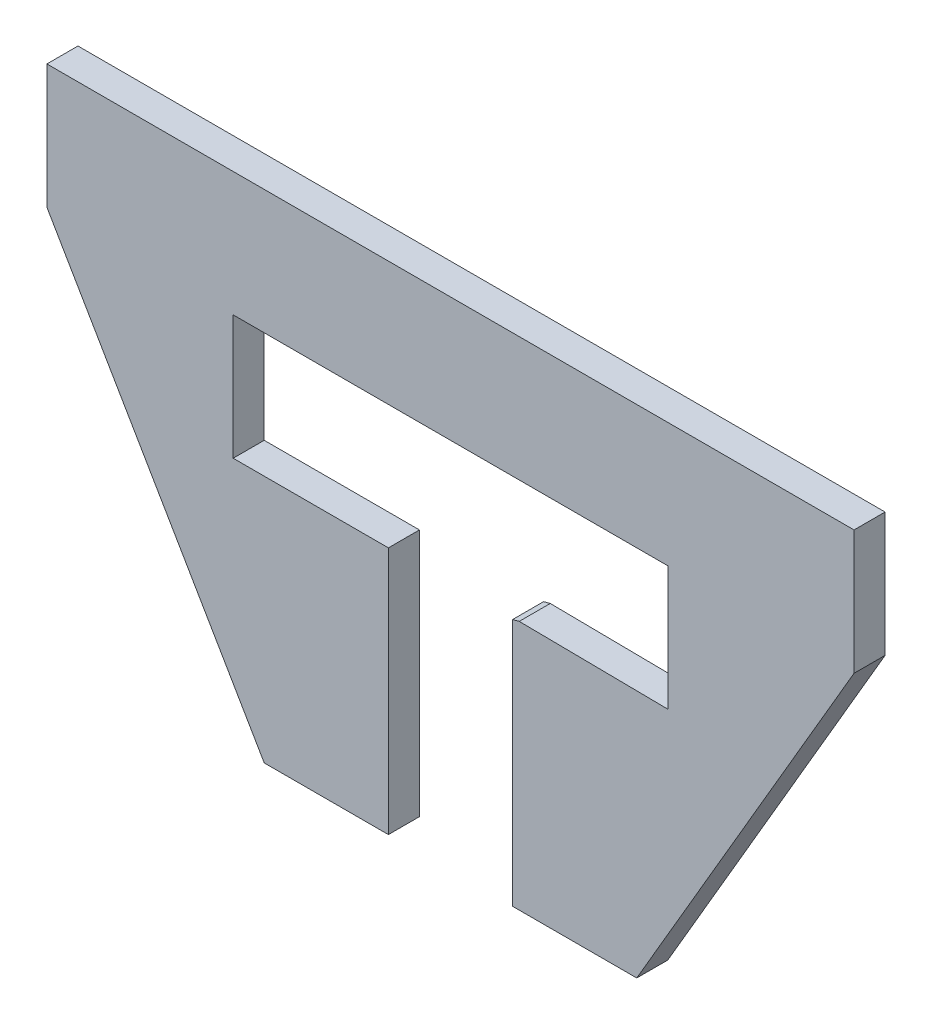
ISO-10303-21;
HEADER;
FILE_DESCRIPTION(('STEP AP214'),'2;1');
FILE_NAME('part.step','',(''),(''),'','','');
FILE_SCHEMA(('AUTOMOTIVE_DESIGN { 1 0 10303 214 1 1 1 1 }'));
ENDSEC;
DATA;
#1=APPLICATION_CONTEXT('core data for automotive mechanical design processes');
#2=APPLICATION_PROTOCOL_DEFINITION('international standard','automotive_design',2000,#1);
#3=PRODUCT_CONTEXT('',#1,'mechanical');
#4=PRODUCT('Part','Part','',(#3));
#5=PRODUCT_RELATED_PRODUCT_CATEGORY('part','',(#4));
#6=PRODUCT_DEFINITION_FORMATION('','',#4);
#7=PRODUCT_DEFINITION_CONTEXT('part definition',#1,'design');
#8=PRODUCT_DEFINITION('design','',#6,#7);
#9=PRODUCT_DEFINITION_SHAPE('','',#8);
#10=(LENGTH_UNIT() NAMED_UNIT(*) SI_UNIT(.MILLI.,.METRE.));
#11=(NAMED_UNIT(*) PLANE_ANGLE_UNIT() SI_UNIT($,.RADIAN.));
#12=(NAMED_UNIT(*) SI_UNIT($,.STERADIAN.) SOLID_ANGLE_UNIT());
#13=UNCERTAINTY_MEASURE_WITH_UNIT(LENGTH_MEASURE(1.E-05),#10,'distance_accuracy_value','');
#14=(GEOMETRIC_REPRESENTATION_CONTEXT(3) GLOBAL_UNCERTAINTY_ASSIGNED_CONTEXT((#13)) GLOBAL_UNIT_ASSIGNED_CONTEXT((#10,
#11,#12)) REPRESENTATION_CONTEXT('',''));
#15=CARTESIAN_POINT('',(0.,0.,0.));
#16=DIRECTION('',(0.,0.,1.));
#17=DIRECTION('',(1.,0.,0.));
#18=AXIS2_PLACEMENT_3D('',#15,#16,#17);
#19=CARTESIAN_POINT('',(0.,0.,6.35));
#20=DIRECTION('',(0.,1.,0.));
#21=DIRECTION('',(0.,0.,1.));
#22=AXIS2_PLACEMENT_3D('',#19,#20,#21);
#23=PLANE('',#22);
#24=DIRECTION('',(1.,0.,0.));
#25=VECTOR('',#24,1.);
#26=CARTESIAN_POINT('',(0.,0.,0.));
#27=LINE('',#26,#25);
#28=CARTESIAN_POINT('',(44.45,0.,0.));
#29=VERTEX_POINT('',#28);
#30=CARTESIAN_POINT('',(69.85,0.,0.));
#31=VERTEX_POINT('',#30);
#32=EDGE_CURVE('E131',#29,#31,#27,.T.);
#33=ORIENTED_EDGE('',*,*,#32,.T.);
#34=DIRECTION('',(0.,0.,1.));
#35=VECTOR('',#34,1.);
#36=CARTESIAN_POINT('',(69.85,0.,0.));
#37=LINE('',#36,#35);
#38=CARTESIAN_POINT('',(69.85,0.,6.35));
#39=VERTEX_POINT('',#38);
#40=EDGE_CURVE('E167',#31,#39,#37,.T.);
#41=ORIENTED_EDGE('',*,*,#40,.T.);
#42=DIRECTION('',(1.,0.,0.));
#43=VECTOR('',#42,1.);
#44=CARTESIAN_POINT('',(0.,0.,6.35));
#45=LINE('',#44,#43);
#46=CARTESIAN_POINT('',(44.45,0.,6.35));
#47=VERTEX_POINT('',#46);
#48=EDGE_CURVE('E252',#47,#39,#45,.T.);
#49=ORIENTED_EDGE('',*,*,#48,.F.);
#50=DIRECTION('',(0.,0.,-1.));
#51=VECTOR('',#50,1.);
#52=CARTESIAN_POINT('',(44.45,0.,6.35));
#53=LINE('',#52,#51);
#54=EDGE_CURVE('E127',#47,#29,#53,.T.);
#55=ORIENTED_EDGE('',*,*,#54,.T.);
#56=EDGE_LOOP('',(#33,#41,#49,#55));
#57=FACE_BOUND('',#56,.T.);
#58=ADVANCED_FACE('F33',(#57),#23,.F.);
#59=CARTESIAN_POINT('',(95.25,0.,6.35));
#60=VERTEX_POINT('',#59);
#61=CARTESIAN_POINT('',(120.65,0.,6.35));
#62=VERTEX_POINT('',#61);
#63=EDGE_CURVE('E92',#60,#62,#45,.T.);
#64=ORIENTED_EDGE('',*,*,#63,.F.);
#65=DIRECTION('',(0.,0.,1.));
#66=VECTOR('',#65,1.);
#67=CARTESIAN_POINT('',(95.25,0.,0.));
#68=LINE('',#67,#66);
#69=CARTESIAN_POINT('',(95.25,0.,0.));
#70=VERTEX_POINT('',#69);
#71=EDGE_CURVE('E249',#70,#60,#68,.T.);
#72=ORIENTED_EDGE('',*,*,#71,.F.);
#73=CARTESIAN_POINT('',(120.65,0.,0.));
#74=VERTEX_POINT('',#73);
#75=EDGE_CURVE('E135',#70,#74,#27,.T.);
#76=ORIENTED_EDGE('',*,*,#75,.T.);
#77=DIRECTION('',(0.,0.,-1.));
#78=VECTOR('',#77,1.);
#79=CARTESIAN_POINT('',(120.65,0.,6.35));
#80=LINE('',#79,#78);
#81=EDGE_CURVE('E11',#62,#74,#80,.T.);
#82=ORIENTED_EDGE('',*,*,#81,.F.);
#83=EDGE_LOOP('',(#64,#72,#76,#82));
#84=FACE_BOUND('',#83,.T.);
#85=ADVANCED_FACE('F35',(#84),#23,.F.);
#86=CARTESIAN_POINT('',(90.0186528497409,-52.5108808290155,6.35));
#87=DIRECTION('',(-0.863778900898433,0.503871025524086,0.));
#88=DIRECTION('',(-0.503871025524086,-0.863778900898434,0.));
#89=AXIS2_PLACEMENT_3D('',#86,#87,#88);
#90=PLANE('',#89);
#91=DIRECTION('',(0.503871025524086,0.863778900898434,0.));
#92=VECTOR('',#91,1.);
#93=CARTESIAN_POINT('',(90.0186528497409,-52.5108808290155,0.));
#94=LINE('',#93,#92);
#95=CARTESIAN_POINT('',(165.1,76.2000000000001,0.));
#96=VERTEX_POINT('',#95);
#97=EDGE_CURVE('E134',#74,#96,#94,.T.);
#98=ORIENTED_EDGE('',*,*,#97,.T.);
#99=DIRECTION('',(0.,0.,-1.));
#100=VECTOR('',#99,1.);
#101=CARTESIAN_POINT('',(165.1,76.2000000000001,6.35));
#102=LINE('',#101,#100);
#103=CARTESIAN_POINT('',(165.1,76.2000000000001,6.35));
#104=VERTEX_POINT('',#103);
#105=EDGE_CURVE('E41',#104,#96,#102,.T.);
#106=ORIENTED_EDGE('',*,*,#105,.F.);
#107=DIRECTION('',(0.503871025524086,0.863778900898434,0.));
#108=VECTOR('',#107,1.);
#109=CARTESIAN_POINT('',(90.0186528497409,-52.5108808290155,6.35));
#110=LINE('',#109,#108);
#111=EDGE_CURVE('E254',#62,#104,#110,.T.);
#112=ORIENTED_EDGE('',*,*,#111,.F.);
#113=ORIENTED_EDGE('',*,*,#81,.T.);
#114=EDGE_LOOP('',(#98,#106,#112,#113));
#115=FACE_BOUND('',#114,.T.);
#116=ADVANCED_FACE('F256',(#115),#90,.F.);
#117=CARTESIAN_POINT('',(165.1,0.,6.35));
#118=DIRECTION('',(-1.,0.,0.));
#119=DIRECTION('',(0.,0.,1.));
#120=AXIS2_PLACEMENT_3D('',#117,#118,#119);
#121=PLANE('',#120);
#122=DIRECTION('',(0.,1.,0.));
#123=VECTOR('',#122,1.);
#124=CARTESIAN_POINT('',(165.1,0.,0.));
#125=LINE('',#124,#123);
#126=CARTESIAN_POINT('',(165.1,101.6,0.));
#127=VERTEX_POINT('',#126);
#128=EDGE_CURVE('E137',#96,#127,#125,.T.);
#129=ORIENTED_EDGE('',*,*,#128,.T.);
#130=DIRECTION('',(0.,0.,-1.));
#131=VECTOR('',#130,1.);
#132=CARTESIAN_POINT('',(165.1,101.6,6.35));
#133=LINE('',#132,#131);
#134=CARTESIAN_POINT('',(165.1,101.6,6.35));
#135=VERTEX_POINT('',#134);
#136=EDGE_CURVE('E115',#135,#127,#133,.T.);
#137=ORIENTED_EDGE('',*,*,#136,.F.);
#138=DIRECTION('',(0.,1.,0.));
#139=VECTOR('',#138,1.);
#140=CARTESIAN_POINT('',(165.1,0.,6.35));
#141=LINE('',#140,#139);
#142=EDGE_CURVE('E122',#104,#135,#141,.T.);
#143=ORIENTED_EDGE('',*,*,#142,.F.);
#144=ORIENTED_EDGE('',*,*,#105,.T.);
#145=EDGE_LOOP('',(#129,#137,#143,#144));
#146=FACE_BOUND('',#145,.T.);
#147=ADVANCED_FACE('F150',(#146),#121,.F.);
#148=CARTESIAN_POINT('',(0.,101.6,6.35));
#149=DIRECTION('',(0.,1.,0.));
#150=DIRECTION('',(0.,0.,1.));
#151=AXIS2_PLACEMENT_3D('',#148,#149,#150);
#152=PLANE('',#151);
#153=DIRECTION('',(1.,0.,0.));
#154=VECTOR('',#153,1.);
#155=CARTESIAN_POINT('',(0.,101.6,0.));
#156=LINE('',#155,#154);
#157=CARTESIAN_POINT('',(0.,101.6,0.));
#158=VERTEX_POINT('',#157);
#159=EDGE_CURVE('E110',#158,#127,#156,.T.);
#160=ORIENTED_EDGE('',*,*,#159,.F.);
#161=DIRECTION('',(0.,0.,-1.));
#162=VECTOR('',#161,1.);
#163=CARTESIAN_POINT('',(0.,101.6,6.35));
#164=LINE('',#163,#162);
#165=CARTESIAN_POINT('',(0.,101.6,6.35));
#166=VERTEX_POINT('',#165);
#167=EDGE_CURVE('E105',#166,#158,#164,.T.);
#168=ORIENTED_EDGE('',*,*,#167,.F.);
#169=DIRECTION('',(1.,0.,0.));
#170=VECTOR('',#169,1.);
#171=CARTESIAN_POINT('',(0.,101.6,6.35));
#172=LINE('',#171,#170);
#173=EDGE_CURVE('E108',#166,#135,#172,.T.);
#174=ORIENTED_EDGE('',*,*,#173,.T.);
#175=ORIENTED_EDGE('',*,*,#136,.T.);
#176=EDGE_LOOP('',(#160,#168,#174,#175));
#177=FACE_BOUND('',#176,.T.);
#178=ADVANCED_FACE('F107',(#177),#152,.T.);
#179=CARTESIAN_POINT('',(0.,0.,6.35));
#180=DIRECTION('',(-1.,0.,0.));
#181=DIRECTION('',(0.,0.,1.));
#182=AXIS2_PLACEMENT_3D('',#179,#180,#181);
#183=PLANE('',#182);
#184=DIRECTION('',(0.,1.,0.));
#185=VECTOR('',#184,1.);
#186=CARTESIAN_POINT('',(0.,0.,0.));
#187=LINE('',#186,#185);
#188=CARTESIAN_POINT('',(0.,76.2,0.));
#189=VERTEX_POINT('',#188);
#190=EDGE_CURVE('E141',#189,#158,#187,.T.);
#191=ORIENTED_EDGE('',*,*,#190,.F.);
#192=DIRECTION('',(0.,0.,-1.));
#193=VECTOR('',#192,1.);
#194=CARTESIAN_POINT('',(0.,76.2,6.35));
#195=LINE('',#194,#193);
#196=CARTESIAN_POINT('',(0.,76.2,6.35));
#197=VERTEX_POINT('',#196);
#198=EDGE_CURVE('E116',#197,#189,#195,.T.);
#199=ORIENTED_EDGE('',*,*,#198,.F.);
#200=DIRECTION('',(0.,1.,0.));
#201=VECTOR('',#200,1.);
#202=CARTESIAN_POINT('',(0.,0.,6.35));
#203=LINE('',#202,#201);
#204=EDGE_CURVE('E120',#197,#166,#203,.T.);
#205=ORIENTED_EDGE('',*,*,#204,.T.);
#206=ORIENTED_EDGE('',*,*,#167,.T.);
#207=EDGE_LOOP('',(#191,#199,#205,#206));
#208=FACE_BOUND('',#207,.T.);
#209=ADVANCED_FACE('F125',(#208),#183,.T.);
#210=CARTESIAN_POINT('',(33.1647668393782,19.3461139896373,6.35));
#211=DIRECTION('',(0.863778900898433,0.503871025524086,0.));
#212=DIRECTION('',(-0.503871025524086,0.863778900898433,0.));
#213=AXIS2_PLACEMENT_3D('',#210,#211,#212);
#214=PLANE('',#213);
#215=DIRECTION('',(0.503871025524086,-0.863778900898433,0.));
#216=VECTOR('',#215,1.);
#217=CARTESIAN_POINT('',(33.1647668393782,19.3461139896373,0.));
#218=LINE('',#217,#216);
#219=EDGE_CURVE('E84',#189,#29,#218,.T.);
#220=ORIENTED_EDGE('',*,*,#219,.T.);
#221=ORIENTED_EDGE('',*,*,#54,.F.);
#222=DIRECTION('',(0.503871025524086,-0.863778900898433,0.));
#223=VECTOR('',#222,1.);
#224=CARTESIAN_POINT('',(33.1647668393782,19.3461139896373,6.35));
#225=LINE('',#224,#223);
#226=EDGE_CURVE('E57',#197,#47,#225,.T.);
#227=ORIENTED_EDGE('',*,*,#226,.F.);
#228=ORIENTED_EDGE('',*,*,#198,.T.);
#229=EDGE_LOOP('',(#220,#221,#227,#228));
#230=FACE_BOUND('',#229,.T.);
#231=ADVANCED_FACE('F325',(#230),#214,.F.);
#232=CARTESIAN_POINT('',(0.,0.,6.35));
#233=DIRECTION('',(0.,0.,1.));
#234=DIRECTION('',(1.,0.,0.));
#235=AXIS2_PLACEMENT_3D('',#232,#233,#234);
#236=PLANE('',#235);
#237=DIRECTION('',(0.,-1.,0.));
#238=VECTOR('',#237,1.);
#239=CARTESIAN_POINT('',(69.85,0.,6.35));
#240=LINE('',#239,#238);
#241=CARTESIAN_POINT('',(69.85,50.8,6.35));
#242=VERTEX_POINT('',#241);
#243=EDGE_CURVE('E233',#242,#39,#240,.T.);
#244=ORIENTED_EDGE('',*,*,#243,.F.);
#245=DIRECTION('',(1.,0.,0.));
#246=VECTOR('',#245,1.);
#247=CARTESIAN_POINT('',(38.1,50.8,6.35));
#248=LINE('',#247,#246);
#249=CARTESIAN_POINT('',(38.1,50.8,6.35));
#250=VERTEX_POINT('',#249);
#251=EDGE_CURVE('E218',#250,#242,#248,.T.);
#252=ORIENTED_EDGE('',*,*,#251,.F.);
#253=DIRECTION('',(0.,-1.,0.));
#254=VECTOR('',#253,1.);
#255=CARTESIAN_POINT('',(38.1,76.2,6.35));
#256=LINE('',#255,#254);
#257=CARTESIAN_POINT('',(38.1,76.2,6.35));
#258=VERTEX_POINT('',#257);
#259=EDGE_CURVE('E227',#258,#250,#256,.T.);
#260=ORIENTED_EDGE('',*,*,#259,.F.);
#261=DIRECTION('',(-1.,0.,0.));
#262=VECTOR('',#261,1.);
#263=CARTESIAN_POINT('',(38.1,76.2,6.35));
#264=LINE('',#263,#262);
#265=CARTESIAN_POINT('',(127.,76.2,6.35));
#266=VERTEX_POINT('',#265);
#267=EDGE_CURVE('E231',#266,#258,#264,.T.);
#268=ORIENTED_EDGE('',*,*,#267,.F.);
#269=DIRECTION('',(0.,1.,0.));
#270=VECTOR('',#269,1.);
#271=CARTESIAN_POINT('',(127.,76.2,6.35));
#272=LINE('',#271,#270);
#273=CARTESIAN_POINT('',(127.,50.8,6.35));
#274=VERTEX_POINT('',#273);
#275=EDGE_CURVE('E286',#274,#266,#272,.T.);
#276=ORIENTED_EDGE('',*,*,#275,.F.);
#277=DIRECTION('',(0.999931260893416,-0.0117249088739658,0.));
#278=VECTOR('',#277,1.);
#279=CARTESIAN_POINT('',(96.6132257549767,51.1563066511975,6.35));
#280=LINE('',#279,#278);
#281=CARTESIAN_POINT('',(96.6132257549767,51.1563066511975,6.35));
#282=VERTEX_POINT('',#281);
#283=EDGE_CURVE('E283',#282,#274,#280,.T.);
#284=ORIENTED_EDGE('',*,*,#283,.F.);
#285=DIRECTION('',(0.967498850455713,0.252875412736932,0.));
#286=VECTOR('',#285,1.);
#287=CARTESIAN_POINT('',(95.25,50.8,6.35));
#288=LINE('',#287,#286);
#289=CARTESIAN_POINT('',(95.25,50.8,6.35));
#290=VERTEX_POINT('',#289);
#291=EDGE_CURVE('E280',#290,#282,#288,.T.);
#292=ORIENTED_EDGE('',*,*,#291,.F.);
#293=DIRECTION('',(0.,1.,0.));
#294=VECTOR('',#293,1.);
#295=CARTESIAN_POINT('',(95.25,0.,6.35));
#296=LINE('',#295,#294);
#297=EDGE_CURVE('E277',#60,#290,#296,.T.);
#298=ORIENTED_EDGE('',*,*,#297,.F.);
#299=ORIENTED_EDGE('',*,*,#63,.T.);
#300=ORIENTED_EDGE('',*,*,#111,.T.);
#301=ORIENTED_EDGE('',*,*,#142,.T.);
#302=ORIENTED_EDGE('',*,*,#173,.F.);
#303=ORIENTED_EDGE('',*,*,#204,.F.);
#304=ORIENTED_EDGE('',*,*,#226,.T.);
#305=ORIENTED_EDGE('',*,*,#48,.T.);
#306=EDGE_LOOP('',(#244,#252,#260,#268,#276,#284,#292,#298,#299,#300,#301,#302,#303,#304,#305));
#307=FACE_BOUND('',#306,.T.);
#308=ADVANCED_FACE('F119',(#307),#236,.T.);
#309=CARTESIAN_POINT('',(0.,0.,0.));
#310=DIRECTION('',(0.,0.,1.));
#311=DIRECTION('',(1.,0.,0.));
#312=AXIS2_PLACEMENT_3D('',#309,#310,#311);
#313=PLANE('',#312);
#314=DIRECTION('',(1.,0.,0.));
#315=VECTOR('',#314,1.);
#316=CARTESIAN_POINT('',(38.1,50.8,0.));
#317=LINE('',#316,#315);
#318=CARTESIAN_POINT('',(38.1,50.8,0.));
#319=VERTEX_POINT('',#318);
#320=CARTESIAN_POINT('',(69.85,50.8,0.));
#321=VERTEX_POINT('',#320);
#322=EDGE_CURVE('E219',#319,#321,#317,.T.);
#323=ORIENTED_EDGE('',*,*,#322,.T.);
#324=DIRECTION('',(0.,-1.,0.));
#325=VECTOR('',#324,1.);
#326=CARTESIAN_POINT('',(69.85,0.,0.));
#327=LINE('',#326,#325);
#328=EDGE_CURVE('E161',#321,#31,#327,.T.);
#329=ORIENTED_EDGE('',*,*,#328,.T.);
#330=ORIENTED_EDGE('',*,*,#32,.F.);
#331=ORIENTED_EDGE('',*,*,#219,.F.);
#332=ORIENTED_EDGE('',*,*,#190,.T.);
#333=ORIENTED_EDGE('',*,*,#159,.T.);
#334=ORIENTED_EDGE('',*,*,#128,.F.);
#335=ORIENTED_EDGE('',*,*,#97,.F.);
#336=ORIENTED_EDGE('',*,*,#75,.F.);
#337=DIRECTION('',(0.,1.,0.));
#338=VECTOR('',#337,1.);
#339=CARTESIAN_POINT('',(95.25,0.,0.));
#340=LINE('',#339,#338);
#341=CARTESIAN_POINT('',(95.25,50.8,0.));
#342=VERTEX_POINT('',#341);
#343=EDGE_CURVE('E235',#70,#342,#340,.T.);
#344=ORIENTED_EDGE('',*,*,#343,.T.);
#345=DIRECTION('',(0.967498850455713,0.252875412736932,0.));
#346=VECTOR('',#345,1.);
#347=CARTESIAN_POINT('',(95.25,50.8,0.));
#348=LINE('',#347,#346);
#349=CARTESIAN_POINT('',(96.6132257549767,51.1563066511975,0.));
#350=VERTEX_POINT('',#349);
#351=EDGE_CURVE('E48',#342,#350,#348,.T.);
#352=ORIENTED_EDGE('',*,*,#351,.T.);
#353=DIRECTION('',(0.999931260893416,-0.0117249088739658,0.));
#354=VECTOR('',#353,1.);
#355=CARTESIAN_POINT('',(96.6132257549767,51.1563066511975,0.));
#356=LINE('',#355,#354);
#357=CARTESIAN_POINT('',(127.,50.8,0.));
#358=VERTEX_POINT('',#357);
#359=EDGE_CURVE('E263',#350,#358,#356,.T.);
#360=ORIENTED_EDGE('',*,*,#359,.T.);
#361=DIRECTION('',(0.,1.,0.));
#362=VECTOR('',#361,1.);
#363=CARTESIAN_POINT('',(127.,76.2,0.));
#364=LINE('',#363,#362);
#365=CARTESIAN_POINT('',(127.,76.2,0.));
#366=VERTEX_POINT('',#365);
#367=EDGE_CURVE('E267',#358,#366,#364,.T.);
#368=ORIENTED_EDGE('',*,*,#367,.T.);
#369=DIRECTION('',(-1.,0.,0.));
#370=VECTOR('',#369,1.);
#371=CARTESIAN_POINT('',(38.1,76.2,0.));
#372=LINE('',#371,#370);
#373=CARTESIAN_POINT('',(38.1,76.2,0.));
#374=VERTEX_POINT('',#373);
#375=EDGE_CURVE('E270',#366,#374,#372,.T.);
#376=ORIENTED_EDGE('',*,*,#375,.T.);
#377=DIRECTION('',(0.,-1.,0.));
#378=VECTOR('',#377,1.);
#379=CARTESIAN_POINT('',(38.1,76.2,0.));
#380=LINE('',#379,#378);
#381=EDGE_CURVE('E273',#374,#319,#380,.T.);
#382=ORIENTED_EDGE('',*,*,#381,.T.);
#383=EDGE_LOOP('',(#323,#329,#330,#331,#332,#333,#334,#335,#336,#344,#352,#360,#368,#376,#382));
#384=FACE_BOUND('',#383,.T.);
#385=ADVANCED_FACE('F155',(#384),#313,.F.);
#386=CARTESIAN_POINT('',(69.85,0.,0.));
#387=DIRECTION('',(-1.,0.,0.));
#388=DIRECTION('',(0.,0.,1.));
#389=AXIS2_PLACEMENT_3D('',#386,#387,#388);
#390=PLANE('',#389);
#391=ORIENTED_EDGE('',*,*,#243,.T.);
#392=ORIENTED_EDGE('',*,*,#40,.F.);
#393=ORIENTED_EDGE('',*,*,#328,.F.);
#394=DIRECTION('',(0.,0.,1.));
#395=VECTOR('',#394,1.);
#396=CARTESIAN_POINT('',(69.85,50.8,0.));
#397=LINE('',#396,#395);
#398=EDGE_CURVE('E223',#321,#242,#397,.T.);
#399=ORIENTED_EDGE('',*,*,#398,.T.);
#400=EDGE_LOOP('',(#391,#392,#393,#399));
#401=FACE_BOUND('',#400,.T.);
#402=ADVANCED_FACE('F330',(#401),#390,.F.);
#403=CARTESIAN_POINT('',(38.1,50.8,0.));
#404=DIRECTION('',(0.,-1.,0.));
#405=DIRECTION('',(0.,0.,-1.));
#406=AXIS2_PLACEMENT_3D('',#403,#404,#405);
#407=PLANE('',#406);
#408=ORIENTED_EDGE('',*,*,#251,.T.);
#409=ORIENTED_EDGE('',*,*,#398,.F.);
#410=ORIENTED_EDGE('',*,*,#322,.F.);
#411=DIRECTION('',(0.,0.,1.));
#412=VECTOR('',#411,1.);
#413=CARTESIAN_POINT('',(38.1,50.8,0.));
#414=LINE('',#413,#412);
#415=EDGE_CURVE('E214',#319,#250,#414,.T.);
#416=ORIENTED_EDGE('',*,*,#415,.T.);
#417=EDGE_LOOP('',(#408,#409,#410,#416));
#418=FACE_BOUND('',#417,.T.);
#419=ADVANCED_FACE('F216',(#418),#407,.F.);
#420=CARTESIAN_POINT('',(38.1,76.2,0.));
#421=DIRECTION('',(-1.,0.,0.));
#422=DIRECTION('',(0.,-1.,0.));
#423=AXIS2_PLACEMENT_3D('',#420,#421,#422);
#424=PLANE('',#423);
#425=ORIENTED_EDGE('',*,*,#259,.T.);
#426=ORIENTED_EDGE('',*,*,#415,.F.);
#427=ORIENTED_EDGE('',*,*,#381,.F.);
#428=DIRECTION('',(0.,0.,1.));
#429=VECTOR('',#428,1.);
#430=CARTESIAN_POINT('',(38.1,76.2,0.));
#431=LINE('',#430,#429);
#432=EDGE_CURVE('E224',#374,#258,#431,.T.);
#433=ORIENTED_EDGE('',*,*,#432,.T.);
#434=EDGE_LOOP('',(#425,#426,#427,#433));
#435=FACE_BOUND('',#434,.T.);
#436=ADVANCED_FACE('F228',(#435),#424,.F.);
#437=CARTESIAN_POINT('',(38.1,76.2,0.));
#438=DIRECTION('',(0.,1.,0.));
#439=DIRECTION('',(-1.,0.,0.));
#440=AXIS2_PLACEMENT_3D('',#437,#438,#439);
#441=PLANE('',#440);
#442=ORIENTED_EDGE('',*,*,#267,.T.);
#443=ORIENTED_EDGE('',*,*,#432,.F.);
#444=ORIENTED_EDGE('',*,*,#375,.F.);
#445=DIRECTION('',(0.,0.,1.));
#446=VECTOR('',#445,1.);
#447=CARTESIAN_POINT('',(127.,76.2,0.));
#448=LINE('',#447,#446);
#449=EDGE_CURVE('E241',#366,#266,#448,.T.);
#450=ORIENTED_EDGE('',*,*,#449,.T.);
#451=EDGE_LOOP('',(#442,#443,#444,#450));
#452=FACE_BOUND('',#451,.T.);
#453=ADVANCED_FACE('F289',(#452),#441,.F.);
#454=CARTESIAN_POINT('',(127.,76.2,0.));
#455=DIRECTION('',(1.,0.,0.));
#456=DIRECTION('',(0.,0.,-1.));
#457=AXIS2_PLACEMENT_3D('',#454,#455,#456);
#458=PLANE('',#457);
#459=ORIENTED_EDGE('',*,*,#275,.T.);
#460=ORIENTED_EDGE('',*,*,#449,.F.);
#461=ORIENTED_EDGE('',*,*,#367,.F.);
#462=DIRECTION('',(0.,0.,1.));
#463=VECTOR('',#462,1.);
#464=CARTESIAN_POINT('',(127.,50.8,0.));
#465=LINE('',#464,#463);
#466=EDGE_CURVE('E243',#358,#274,#465,.T.);
#467=ORIENTED_EDGE('',*,*,#466,.T.);
#468=EDGE_LOOP('',(#459,#460,#461,#467));
#469=FACE_BOUND('',#468,.T.);
#470=ADVANCED_FACE('F295',(#469),#458,.F.);
#471=CARTESIAN_POINT('',(96.6132257549767,51.1563066511975,0.));
#472=DIRECTION('',(-0.0117249088739658,-0.999931260893416,0.));
#473=DIRECTION('',(0.999931260893416,-0.0117249088739658,0.));
#474=AXIS2_PLACEMENT_3D('',#471,#472,#473);
#475=PLANE('',#474);
#476=ORIENTED_EDGE('',*,*,#283,.T.);
#477=ORIENTED_EDGE('',*,*,#466,.F.);
#478=ORIENTED_EDGE('',*,*,#359,.F.);
#479=DIRECTION('',(0.,0.,1.));
#480=VECTOR('',#479,1.);
#481=CARTESIAN_POINT('',(96.6132257549767,51.1563066511975,0.));
#482=LINE('',#481,#480);
#483=EDGE_CURVE('E245',#350,#282,#482,.T.);
#484=ORIENTED_EDGE('',*,*,#483,.T.);
#485=EDGE_LOOP('',(#476,#477,#478,#484));
#486=FACE_BOUND('',#485,.T.);
#487=ADVANCED_FACE('F299',(#486),#475,.F.);
#488=CARTESIAN_POINT('',(95.25,50.8,0.));
#489=DIRECTION('',(0.252875412736932,-0.967498850455713,0.));
#490=DIRECTION('',(0.967498850455713,0.252875412736932,0.));
#491=AXIS2_PLACEMENT_3D('',#488,#489,#490);
#492=PLANE('',#491);
#493=ORIENTED_EDGE('',*,*,#291,.T.);
#494=ORIENTED_EDGE('',*,*,#483,.F.);
#495=ORIENTED_EDGE('',*,*,#351,.F.);
#496=DIRECTION('',(0.,0.,1.));
#497=VECTOR('',#496,1.);
#498=CARTESIAN_POINT('',(95.25,50.8,0.));
#499=LINE('',#498,#497);
#500=EDGE_CURVE('E247',#342,#290,#499,.T.);
#501=ORIENTED_EDGE('',*,*,#500,.T.);
#502=EDGE_LOOP('',(#493,#494,#495,#501));
#503=FACE_BOUND('',#502,.T.);
#504=ADVANCED_FACE('F300',(#503),#492,.F.);
#505=CARTESIAN_POINT('',(95.25,0.,0.));
#506=DIRECTION('',(1.,0.,0.));
#507=DIRECTION('',(0.,0.,-1.));
#508=AXIS2_PLACEMENT_3D('',#505,#506,#507);
#509=PLANE('',#508);
#510=ORIENTED_EDGE('',*,*,#297,.T.);
#511=ORIENTED_EDGE('',*,*,#500,.F.);
#512=ORIENTED_EDGE('',*,*,#343,.F.);
#513=ORIENTED_EDGE('',*,*,#71,.T.);
#514=EDGE_LOOP('',(#510,#511,#512,#513));
#515=FACE_BOUND('',#514,.T.);
#516=ADVANCED_FACE('F301',(#515),#509,.F.);
#517=CLOSED_SHELL('',(#58,#85,#116,#147,#178,#209,#231,#308,#385,#402,#419,#436,#453,#470,#487,
#504,#516));
#518=MANIFOLD_SOLID_BREP('B2',#517);
#519=ADVANCED_BREP_SHAPE_REPRESENTATION('',(#18,#518),#14);
#520=SHAPE_DEFINITION_REPRESENTATION(#9,#519);
ENDSEC;
END-ISO-10303-21;
